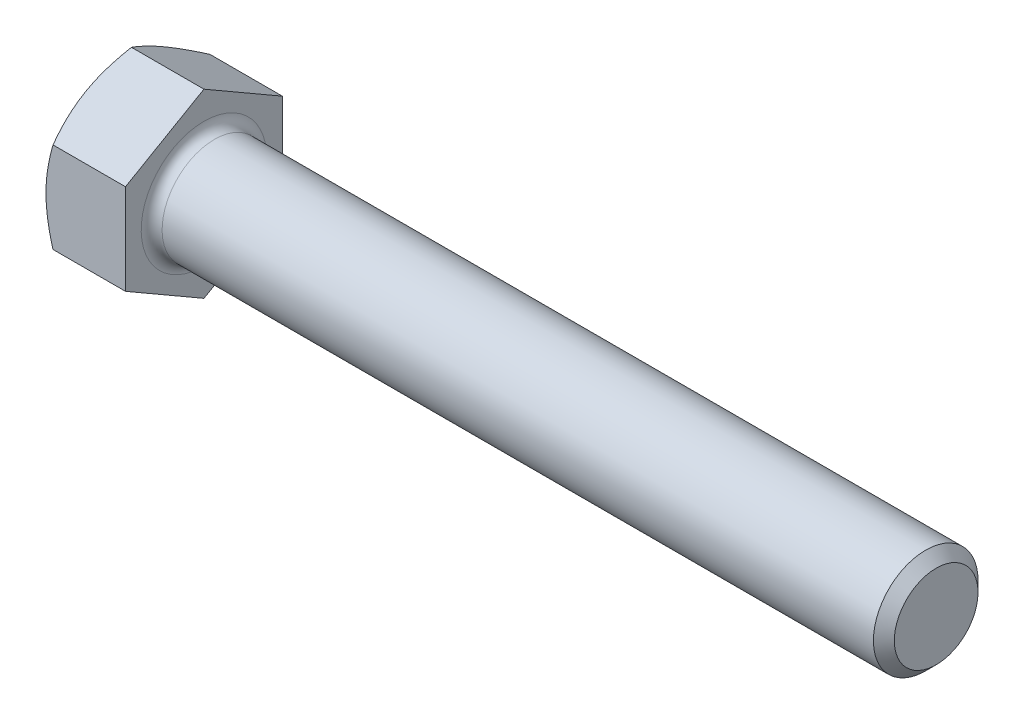
ISO-10303-21;
HEADER;
FILE_DESCRIPTION(('STEP AP214'),'2;1');
FILE_NAME('part.step','',(''),(''),'','','');
FILE_SCHEMA(('AUTOMOTIVE_DESIGN { 1 0 10303 214 1 1 1 1 }'));
ENDSEC;
DATA;
#1=APPLICATION_CONTEXT('core data for automotive mechanical design processes');
#2=APPLICATION_PROTOCOL_DEFINITION('international standard','automotive_design',2000,#1);
#3=PRODUCT_CONTEXT('',#1,'mechanical');
#4=PRODUCT('Part','Part','',(#3));
#5=PRODUCT_RELATED_PRODUCT_CATEGORY('part','',(#4));
#6=PRODUCT_DEFINITION_FORMATION('','',#4);
#7=PRODUCT_DEFINITION_CONTEXT('part definition',#1,'design');
#8=PRODUCT_DEFINITION('design','',#6,#7);
#9=PRODUCT_DEFINITION_SHAPE('','',#8);
#10=(LENGTH_UNIT() NAMED_UNIT(*) SI_UNIT(.MILLI.,.METRE.));
#11=(NAMED_UNIT(*) PLANE_ANGLE_UNIT() SI_UNIT($,.RADIAN.));
#12=(NAMED_UNIT(*) SI_UNIT($,.STERADIAN.) SOLID_ANGLE_UNIT());
#13=UNCERTAINTY_MEASURE_WITH_UNIT(LENGTH_MEASURE(1.E-05),#10,'distance_accuracy_value','');
#14=(GEOMETRIC_REPRESENTATION_CONTEXT(3) GLOBAL_UNCERTAINTY_ASSIGNED_CONTEXT((#13)) GLOBAL_UNIT_ASSIGNED_CONTEXT((#10,
#11,#12)) REPRESENTATION_CONTEXT('',''));
#15=CARTESIAN_POINT('',(0.,0.,0.));
#16=DIRECTION('',(0.,0.,1.));
#17=DIRECTION('',(1.,0.,0.));
#18=AXIS2_PLACEMENT_3D('',#15,#16,#17);
#19=CARTESIAN_POINT('',(-4.826,2.74963065701559,-4.7625));
#20=DIRECTION('',(0.,-0.866025403784439,0.499999999999999));
#21=DIRECTION('',(0.,-0.5,-0.866025403784439));
#22=AXIS2_PLACEMENT_3D('',#19,#20,#21);
#23=PLANE('',#22);
#24=CARTESIAN_POINT('',(-4.40056398824924,5.49937678408502,0.000200000000005412));
#25=CARTESIAN_POINT('',(-4.47034638758606,5.37853889601657,-0.209097361613873));
#26=CARTESIAN_POINT('',(-4.53381673538478,5.25666747870888,-0.420184848381223));
#27=CARTESIAN_POINT('',(-4.64460480393128,5.01081433128269,-0.846014990924108));
#28=CARTESIAN_POINT('',(-4.69188333457021,4.88682823299882,-1.060765212584));
#29=CARTESIAN_POINT('',(-4.76546647463122,4.64037371706653,-1.48763695593352));
#30=CARTESIAN_POINT('',(-4.79226120779827,4.5179436811604,-1.69969199849541));
#31=CARTESIAN_POINT('',(-4.81628887781912,4.33386795649884,-2.01852050604929));
#32=CARTESIAN_POINT('',(-4.82160535899069,4.27246738882597,-2.12486940887228));
#33=CARTESIAN_POINT('',(-4.8267598365683,4.1496095068933,-2.33766550248997));
#34=CARTESIAN_POINT('',(-4.82659800219079,4.08815219444488,-2.44411269014726));
#35=CARTESIAN_POINT('',(-4.81861505017809,3.9197756106675,-2.73574948805455));
#36=CARTESIAN_POINT('',(-4.80520757951211,3.81291212955969,-2.92084246680696));
#37=CARTESIAN_POINT('',(-4.76269213715631,3.59989441060936,-3.28979997894136));
#38=CARTESIAN_POINT('',(-4.7335696317199,3.49374092153974,-3.47366321541066));
#39=CARTESIAN_POINT('',(-4.6607707464131,3.28029401006835,-3.84336411079776));
#40=CARTESIAN_POINT('',(-4.61678588695335,3.17302752682367,-4.02915510972678));
#41=CARTESIAN_POINT('',(-4.51695772006118,2.96009430473234,-4.39796626900832));
#42=CARTESIAN_POINT('',(-4.46113786532195,2.85442483842812,-4.5809911534559));
#43=CARTESIAN_POINT('',(-4.40056398824924,2.74951518696175,-4.7627));
#44=B_SPLINE_CURVE_WITH_KNOTS('',3,(#24,#25,#26,#27,#28,#29,#30,#31,#32,#33,#34,#35,#36,#37,#38,
#39,#40,#41,#42,#43),.UNSPECIFIED.,.F.,.F.,(4,2,2,2,2,2,2,2,2,4),(0.,0.754910190012916,
1.51163483480638,2.24963134670894,2.61827336240839,2.9869039913527,3.62867423192249,
4.27103902109236,4.92765153591996,5.58297484368455),.UNSPECIFIED.);
#45=CARTESIAN_POINT('',(-4.4006306570156,5.49926131403118,0.));
#46=VERTEX_POINT('',#45);
#47=CARTESIAN_POINT('',(-4.826,4.12444598552339,-2.38124999999999));
#48=VERTEX_POINT('',#47);
#49=EDGE_CURVE('E112',#46,#48,#44,.T.);
#50=ORIENTED_EDGE('',*,*,#49,.F.);
#51=DIRECTION('',(1.,0.,0.));
#52=VECTOR('',#51,1.);
#53=CARTESIAN_POINT('',(-4.826,5.49926131403118,0.));
#54=LINE('',#53,#52);
#55=CARTESIAN_POINT('',(0.,5.49926131403118,0.));
#56=VERTEX_POINT('',#55);
#57=EDGE_CURVE('E125',#46,#56,#54,.T.);
#58=ORIENTED_EDGE('',*,*,#57,.T.);
#59=DIRECTION('',(0.,-0.5,-0.866025403784439));
#60=VECTOR('',#59,1.);
#61=CARTESIAN_POINT('',(0.,2.74963065701559,-4.7625));
#62=LINE('',#61,#60);
#63=CARTESIAN_POINT('',(0.,2.74963065701559,-4.7625));
#64=VERTEX_POINT('',#63);
#65=EDGE_CURVE('E129',#56,#64,#62,.T.);
#66=ORIENTED_EDGE('',*,*,#65,.T.);
#67=DIRECTION('',(1.,0.,0.));
#68=VECTOR('',#67,1.);
#69=CARTESIAN_POINT('',(-4.826,2.74963065701559,-4.7625));
#70=LINE('',#69,#68);
#71=CARTESIAN_POINT('',(-4.4006306570156,2.74963065701559,-4.7625));
#72=VERTEX_POINT('',#71);
#73=EDGE_CURVE('E148',#72,#64,#70,.T.);
#74=ORIENTED_EDGE('',*,*,#73,.F.);
#75=EDGE_CURVE('E128',#48,#72,#44,.T.);
#76=ORIENTED_EDGE('',*,*,#75,.F.);
#77=EDGE_LOOP('',(#50,#58,#66,#74,#76));
#78=FACE_BOUND('',#77,.T.);
#79=ADVANCED_FACE('F36',(#78),#23,.F.);
#80=CARTESIAN_POINT('',(-4.826,-2.74963065701559,-4.7625));
#81=DIRECTION('',(0.,0.,1.));
#82=DIRECTION('',(0.,-1.,0.));
#83=AXIS2_PLACEMENT_3D('',#80,#81,#82);
#84=PLANE('',#83);
#85=CARTESIAN_POINT('',(-2.53865492995422,-7.30971731156661,-4.7625));
#86=CARTESIAN_POINT('',(-2.63894582516318,-7.10233411794664,-4.7625));
#87=CARTESIAN_POINT('',(-2.73825279152594,-6.89446659321094,-4.7625));
#88=CARTESIAN_POINT('',(-2.93434388978706,-6.47750501700678,-4.7625));
#89=CARTESIAN_POINT('',(-3.03112760832201,-6.26841077136273,-4.7625));
#90=CARTESIAN_POINT('',(-3.22212058726197,-5.84762353880586,-4.7625));
#91=CARTESIAN_POINT('',(-3.31631227627624,-5.63592254799053,-4.7625));
#92=CARTESIAN_POINT('',(-3.50073783411751,-5.2108098706162,-4.7625));
#93=CARTESIAN_POINT('',(-3.59097189530315,-4.99739826779835,-4.7625));
#94=CARTESIAN_POINT('',(-3.76913037535412,-4.56193618326943,-4.7625));
#95=CARTESIAN_POINT('',(-3.85689893159286,-4.33982157619656,-4.7625));
#96=CARTESIAN_POINT('',(-4.02560705643309,-3.89296573863796,-4.7625));
#97=CARTESIAN_POINT('',(-4.10654584809015,-3.6682242126196,-4.7625));
#98=CARTESIAN_POINT('',(-4.25941364359694,-3.21620296888463,-4.7625));
#99=CARTESIAN_POINT('',(-4.33136156692013,-2.98892971583964,-4.7625));
#100=CARTESIAN_POINT('',(-4.46388883392356,-2.53112455985058,-4.7625));
#101=CARTESIAN_POINT('',(-4.52447184026846,-2.30059373259607,-4.7625));
#102=CARTESIAN_POINT('',(-4.6309943175041,-1.83740766983983,-4.7625));
#103=CARTESIAN_POINT('',(-4.67701029190918,-1.60477036374114,-4.7625));
#104=CARTESIAN_POINT('',(-4.75174576579707,-1.13668440796651,-4.7625));
#105=CARTESIAN_POINT('',(-4.78046675134188,-0.901236001606197,-4.7625));
#106=CARTESIAN_POINT('',(-4.81794377379008,-0.431746037216489,-4.7625));
#107=CARTESIAN_POINT('',(-4.82695039796689,-0.197724985343648,-4.7625));
#108=CARTESIAN_POINT('',(-4.82489021390358,0.270245165970698,-4.7625));
#109=CARTESIAN_POINT('',(-4.81382285651618,0.504194263268692,-4.7625));
#110=CARTESIAN_POINT('',(-4.77855727161905,0.903673507099814,-4.7625));
#111=CARTESIAN_POINT('',(-4.75901888428981,1.06963824347709,-4.7625));
#112=CARTESIAN_POINT('',(-4.71109832669434,1.4002949446895,-4.7625));
#113=CARTESIAN_POINT('',(-4.68271488786702,1.56498672348217,-4.7625));
#114=CARTESIAN_POINT('',(-4.58579509515289,2.05696621832222,-4.7625));
#115=CARTESIAN_POINT('',(-4.50550882608358,2.38196188542261,-4.7625));
#116=CARTESIAN_POINT('',(-4.36703014941268,2.86781398854699,-4.7625));
#117=CARTESIAN_POINT('',(-4.31723714803653,3.03120713132935,-4.7625));
#118=CARTESIAN_POINT('',(-4.21266440559822,3.35640511661037,-4.7625));
#119=CARTESIAN_POINT('',(-4.15788463273706,3.51820994897361,-4.7625));
#120=CARTESIAN_POINT('',(-4.04420190764095,3.84028616885704,-4.7625));
#121=CARTESIAN_POINT('',(-3.9853004369361,4.00055808407178,-4.7625));
#122=CARTESIAN_POINT('',(-3.86404874825557,4.31978669318692,-4.7625));
#123=CARTESIAN_POINT('',(-3.80169856215817,4.47874339922889,-4.7625));
#124=CARTESIAN_POINT('',(-3.65635700460677,4.8396055882017,-4.7625));
#125=CARTESIAN_POINT('',(-3.57245322794143,5.04114279911414,-4.7625));
#126=CARTESIAN_POINT('',(-3.40089342493739,5.44261795808367,-4.7625));
#127=CARTESIAN_POINT('',(-3.31323721756385,5.64255582842752,-4.76249999999999));
#128=CARTESIAN_POINT('',(-3.13488930867042,6.04110971320488,-4.76249999999999));
#129=CARTESIAN_POINT('',(-3.04419710529245,6.23972550252466,-4.76249999999999));
#130=CARTESIAN_POINT('',(-2.86034980666286,6.63581552297746,-4.76249999999999));
#131=CARTESIAN_POINT('',(-2.76719466563982,6.83328973281206,-4.76249999999999));
#132=CARTESIAN_POINT('',(-2.48455741628422,7.42461069797956,-4.76249999999999));
#133=CARTESIAN_POINT('',(-2.29205806653975,7.817014673705,-4.76249999999999));
#134=CARTESIAN_POINT('',(-1.90151383619552,8.5990520506164,-4.76249999999999));
#135=CARTESIAN_POINT('',(-1.70346877205877,8.98868535956997,-4.76249999999999));
#136=CARTESIAN_POINT('',(-1.31897377005232,9.7356118369776,-4.76249999999999));
#137=CARTESIAN_POINT('',(-1.13282282853607,10.093059202551,-4.76249999999999));
#138=CARTESIAN_POINT('',(-0.75794689692703,10.8066127209674,-4.76249999999999));
#139=CARTESIAN_POINT('',(-0.569221831900088,11.1627188343791,-4.76249999999999));
#140=CARTESIAN_POINT('',(-0.190210631481143,11.8730921528281,-4.76249999999999));
#141=CARTESIAN_POINT('',(7.11576984302486E-05,12.2273616797313,-4.76249999999999));
#142=CARTESIAN_POINT('',(0.382198882261842,12.9350341524318,-4.76249999999999));
#143=CARTESIAN_POINT('',(0.574044740694436,13.2884371397628,-4.76249999999999));
#144=CARTESIAN_POINT('',(0.766479229564005,13.6415169914972,-4.76249999999999));
#145=B_SPLINE_CURVE_WITH_KNOTS('',3,(#85,#86,#87,#88,#89,#90,#91,#92,#93,#94,#95,#96,#97,#98,
#99,#100,#101,#102,#103,#104,#105,#106,#107,#108,#109,#110,#111,#112,#113,#114,#115,#116,#117,
#118,#119,#120,#121,#122,#123,#124,#125,#126,#127,#128,#129,#130,#131,#132,#133,#134,#135,#136,
#137,#138,#139,#140,#141,#142,#143,#144),.UNSPECIFIED.,.F.,.F.,(4,2,2,2,2,2,2,2,2,2,2,2,2,2,2,2,
2,2,2,2,2,2,2,2,2,2,2,2,2,4),(0.,0.691090929530282,1.38229437243686,2.07739107275608,
2.77245395070163,3.48884745798766,4.20532235163324,4.92026322857102,5.63497329833932,
6.3458650497355,7.05669570944579,7.75843728919175,8.46019806619033,8.96128606484996,
9.46244596286593,10.4653546355007,10.9777490611263,11.4901467543507,12.0023612047988,
12.514570921371,13.1694362862203,13.8243332805291,14.4793390708444,15.1343570424044,
16.4455162651803,17.7567189325479,18.9657490980689,20.1748145345615,21.3812208217427,
22.5875681084214),.UNSPECIFIED.);
#146=CARTESIAN_POINT('',(-4.826,0.,-4.7625));
#147=VERTEX_POINT('',#146);
#148=EDGE_CURVE('E194',#72,#147,#145,.F.);
#149=ORIENTED_EDGE('',*,*,#148,.F.);
#150=ORIENTED_EDGE('',*,*,#73,.T.);
#151=DIRECTION('',(0.,-1.,0.));
#152=VECTOR('',#151,1.);
#153=CARTESIAN_POINT('',(0.,-2.74963065701559,-4.7625));
#154=LINE('',#153,#152);
#155=CARTESIAN_POINT('',(0.,-2.74963065701559,-4.7625));
#156=VERTEX_POINT('',#155);
#157=EDGE_CURVE('E404',#64,#156,#154,.T.);
#158=ORIENTED_EDGE('',*,*,#157,.T.);
#159=DIRECTION('',(1.,0.,0.));
#160=VECTOR('',#159,1.);
#161=CARTESIAN_POINT('',(-4.826,-2.74963065701559,-4.7625));
#162=LINE('',#161,#160);
#163=CARTESIAN_POINT('',(-4.4006306570156,-2.74963065701559,-4.7625));
#164=VERTEX_POINT('',#163);
#165=EDGE_CURVE('E146',#164,#156,#162,.T.);
#166=ORIENTED_EDGE('',*,*,#165,.F.);
#167=EDGE_CURVE('E195',#147,#164,#145,.F.);
#168=ORIENTED_EDGE('',*,*,#167,.F.);
#169=EDGE_LOOP('',(#149,#150,#158,#166,#168));
#170=FACE_BOUND('',#169,.T.);
#171=ADVANCED_FACE('F174',(#170),#84,.F.);
#172=CARTESIAN_POINT('',(-4.826,-5.49926131403118,0.));
#173=DIRECTION('',(0.,0.866025403784438,0.5));
#174=DIRECTION('',(0.,-0.5,0.866025403784438));
#175=AXIS2_PLACEMENT_3D('',#172,#173,#174);
#176=PLANE('',#175);
#177=CARTESIAN_POINT('',(-4.40056398824924,-2.74951518696175,-4.7627));
#178=CARTESIAN_POINT('',(-4.47034638758606,-2.8703530750302,-4.55340263838612));
#179=CARTESIAN_POINT('',(-4.53381673538478,-2.99222449233789,-4.34231515161877));
#180=CARTESIAN_POINT('',(-4.64460480393128,-3.23807763976409,-3.91648500907589));
#181=CARTESIAN_POINT('',(-4.69188333457021,-3.36206373804796,-3.701734787416));
#182=CARTESIAN_POINT('',(-4.76546647463122,-3.60851825398025,-3.27486304406647));
#183=CARTESIAN_POINT('',(-4.79226120779828,-3.73094828988637,-3.06280800150458));
#184=CARTESIAN_POINT('',(-4.81628887781913,-3.91502401454793,-2.7439794939507));
#185=CARTESIAN_POINT('',(-4.82160535899069,-3.9764245822208,-2.63763059112772));
#186=CARTESIAN_POINT('',(-4.8267598365683,-4.09928246415348,-2.42483449751002));
#187=CARTESIAN_POINT('',(-4.8265980021908,-4.16073977660189,-2.31838730985274));
#188=CARTESIAN_POINT('',(-4.81861505017809,-4.32911636037927,-2.02675051194544));
#189=CARTESIAN_POINT('',(-4.80520757951211,-4.43597984148708,-1.84165753319303));
#190=CARTESIAN_POINT('',(-4.76269213715631,-4.64899756043742,-1.47270002105863));
#191=CARTESIAN_POINT('',(-4.7335696317199,-4.75515104950704,-1.28883678458933));
#192=CARTESIAN_POINT('',(-4.6607707464131,-4.96859796097843,-0.919135889202235));
#193=CARTESIAN_POINT('',(-4.61678588695335,-5.07586444422311,-0.733344890273215));
#194=CARTESIAN_POINT('',(-4.51695772006118,-5.28879766631444,-0.364533730991681));
#195=CARTESIAN_POINT('',(-4.46113786532195,-5.39446713261865,-0.181508846544095));
#196=CARTESIAN_POINT('',(-4.40056398824924,-5.49937678408502,0.000199999999996873));
#197=B_SPLINE_CURVE_WITH_KNOTS('',3,(#177,#178,#179,#180,#181,#182,#183,#184,#185,#186,#187,
#188,#189,#190,#191,#192,#193,#194,#195,#196),.UNSPECIFIED.,.F.,.F.,(4,2,2,2,2,2,2,2,2,4),(0.,
0.754910190012916,1.51163483480638,2.24963134670895,2.61827336240839,2.9869039913527,
3.62867423192249,4.27103902109236,4.92765153591996,5.58297484368455),.UNSPECIFIED.);
#198=CARTESIAN_POINT('',(-4.826,-4.12444598552338,-2.38125));
#199=VERTEX_POINT('',#198);
#200=EDGE_CURVE('E233',#164,#199,#197,.T.);
#201=ORIENTED_EDGE('',*,*,#200,.F.);
#202=ORIENTED_EDGE('',*,*,#165,.T.);
#203=DIRECTION('',(0.,-0.5,0.866025403784438));
#204=VECTOR('',#203,1.);
#205=CARTESIAN_POINT('',(0.,-5.49926131403118,0.));
#206=LINE('',#205,#204);
#207=CARTESIAN_POINT('',(0.,-5.49926131403118,0.));
#208=VERTEX_POINT('',#207);
#209=EDGE_CURVE('E405',#156,#208,#206,.T.);
#210=ORIENTED_EDGE('',*,*,#209,.T.);
#211=DIRECTION('',(1.,0.,0.));
#212=VECTOR('',#211,1.);
#213=CARTESIAN_POINT('',(-4.826,-5.49926131403118,0.));
#214=LINE('',#213,#212);
#215=CARTESIAN_POINT('',(-4.4006306570156,-5.49926131403118,0.));
#216=VERTEX_POINT('',#215);
#217=EDGE_CURVE('E144',#216,#208,#214,.T.);
#218=ORIENTED_EDGE('',*,*,#217,.F.);
#219=EDGE_CURVE('E229',#199,#216,#197,.T.);
#220=ORIENTED_EDGE('',*,*,#219,.F.);
#221=EDGE_LOOP('',(#201,#202,#210,#218,#220));
#222=FACE_BOUND('',#221,.T.);
#223=ADVANCED_FACE('F179',(#222),#176,.F.);
#224=CARTESIAN_POINT('',(-4.826,-2.7496306570156,4.7625));
#225=DIRECTION('',(0.,0.866025403784439,-0.499999999999999));
#226=DIRECTION('',(0.,0.499999999999999,0.866025403784439));
#227=AXIS2_PLACEMENT_3D('',#224,#225,#226);
#228=PLANE('',#227);
#229=CARTESIAN_POINT('',(-4.40056398824924,-5.49937678408502,-0.000200000000003331));
#230=CARTESIAN_POINT('',(-4.47034638758606,-5.37853889601657,0.209097361613875));
#231=CARTESIAN_POINT('',(-4.53381673538478,-5.25666747870888,0.420184848381226));
#232=CARTESIAN_POINT('',(-4.64460480393128,-5.01081433128269,0.846014990924112));
#233=CARTESIAN_POINT('',(-4.69188333457021,-4.88682823299882,1.060765212584));
#234=CARTESIAN_POINT('',(-4.76546647463122,-4.64037371706653,1.48763695593353));
#235=CARTESIAN_POINT('',(-4.79226120779828,-4.5179436811604,1.69969199849541));
#236=CARTESIAN_POINT('',(-4.81628887781913,-4.33386795649884,2.0185205060493));
#237=CARTESIAN_POINT('',(-4.82160535899069,-4.27246738882597,2.12486940887228));
#238=CARTESIAN_POINT('',(-4.8267598365683,-4.1496095068933,2.33766550248998));
#239=CARTESIAN_POINT('',(-4.8265980021908,-4.08815219444488,2.44411269014726));
#240=CARTESIAN_POINT('',(-4.81861505017809,-3.9197756106675,2.73574948805456));
#241=CARTESIAN_POINT('',(-4.80520757951211,-3.81291212955969,2.92084246680697));
#242=CARTESIAN_POINT('',(-4.76269213715631,-3.59989441060936,3.28979997894137));
#243=CARTESIAN_POINT('',(-4.7335696317199,-3.49374092153974,3.47366321541067));
#244=CARTESIAN_POINT('',(-4.6607707464131,-3.28029401006835,3.84336411079776));
#245=CARTESIAN_POINT('',(-4.61678588695335,-3.17302752682367,4.02915510972678));
#246=CARTESIAN_POINT('',(-4.51695772006118,-2.96009430473234,4.39796626900832));
#247=CARTESIAN_POINT('',(-4.46113786532195,-2.85442483842813,4.5809911534559));
#248=CARTESIAN_POINT('',(-4.40056398824924,-2.74951518696176,4.7627));
#249=B_SPLINE_CURVE_WITH_KNOTS('',3,(#229,#230,#231,#232,#233,#234,#235,#236,#237,#238,#239,
#240,#241,#242,#243,#244,#245,#246,#247,#248),.UNSPECIFIED.,.F.,.F.,(4,2,2,2,2,2,2,2,2,4),(0.,
0.754910190012917,1.51163483480638,2.24963134670895,2.61827336240839,2.9869039913527,
3.62867423192249,4.27103902109236,4.92765153591996,5.58297484368455),.UNSPECIFIED.);
#250=CARTESIAN_POINT('',(-4.826,-4.12444598552339,2.38125));
#251=VERTEX_POINT('',#250);
#252=EDGE_CURVE('E59',#216,#251,#249,.T.);
#253=ORIENTED_EDGE('',*,*,#252,.F.);
#254=ORIENTED_EDGE('',*,*,#217,.T.);
#255=DIRECTION('',(0.,0.499999999999999,0.866025403784439));
#256=VECTOR('',#255,1.);
#257=CARTESIAN_POINT('',(0.,-2.7496306570156,4.7625));
#258=LINE('',#257,#256);
#259=CARTESIAN_POINT('',(0.,-2.7496306570156,4.7625));
#260=VERTEX_POINT('',#259);
#261=EDGE_CURVE('E401',#208,#260,#258,.T.);
#262=ORIENTED_EDGE('',*,*,#261,.T.);
#263=DIRECTION('',(1.,0.,0.));
#264=VECTOR('',#263,1.);
#265=CARTESIAN_POINT('',(-4.826,-2.7496306570156,4.7625));
#266=LINE('',#265,#264);
#267=CARTESIAN_POINT('',(-4.4006306570156,-2.7496306570156,4.7625));
#268=VERTEX_POINT('',#267);
#269=EDGE_CURVE('E137',#268,#260,#266,.T.);
#270=ORIENTED_EDGE('',*,*,#269,.F.);
#271=EDGE_CURVE('E224',#251,#268,#249,.T.);
#272=ORIENTED_EDGE('',*,*,#271,.F.);
#273=EDGE_LOOP('',(#253,#254,#262,#270,#272));
#274=FACE_BOUND('',#273,.T.);
#275=ADVANCED_FACE('F236',(#274),#228,.F.);
#276=CARTESIAN_POINT('',(-4.826,2.74963065701559,4.7625));
#277=DIRECTION('',(0.,0.,-1.));
#278=DIRECTION('',(0.,1.,0.));
#279=AXIS2_PLACEMENT_3D('',#276,#277,#278);
#280=PLANE('',#279);
#281=CARTESIAN_POINT('',(-2.53865492995422,-7.30971731156661,4.76249999999999));
#282=CARTESIAN_POINT('',(-2.63894582516318,-7.10233411794665,4.76249999999999));
#283=CARTESIAN_POINT('',(-2.73825279152594,-6.89446659321094,4.76249999999999));
#284=CARTESIAN_POINT('',(-2.93434388978706,-6.47750501700678,4.76249999999999));
#285=CARTESIAN_POINT('',(-3.03112760832201,-6.26841077136274,4.76249999999999));
#286=CARTESIAN_POINT('',(-3.22212058726197,-5.84762353880587,4.76249999999999));
#287=CARTESIAN_POINT('',(-3.31631227627624,-5.63592254799054,4.76249999999999));
#288=CARTESIAN_POINT('',(-3.50073783411751,-5.21080987061621,4.76249999999999));
#289=CARTESIAN_POINT('',(-3.59097189530315,-4.99739826779836,4.76249999999999));
#290=CARTESIAN_POINT('',(-3.76913037535412,-4.56193618326944,4.76249999999999));
#291=CARTESIAN_POINT('',(-3.85689893159286,-4.33982157619657,4.76249999999999));
#292=CARTESIAN_POINT('',(-4.02560705643309,-3.89296573863797,4.76249999999999));
#293=CARTESIAN_POINT('',(-4.10654584809015,-3.6682242126196,4.76249999999999));
#294=CARTESIAN_POINT('',(-4.25941364359694,-3.21620296888463,4.76249999999999));
#295=CARTESIAN_POINT('',(-4.33136156692013,-2.98892971583965,4.7625));
#296=CARTESIAN_POINT('',(-4.46388883392356,-2.53112455985059,4.7625));
#297=CARTESIAN_POINT('',(-4.52447184026846,-2.30059373259607,4.7625));
#298=CARTESIAN_POINT('',(-4.6309943175041,-1.83740766983984,4.7625));
#299=CARTESIAN_POINT('',(-4.67701029190918,-1.60477036374115,4.7625));
#300=CARTESIAN_POINT('',(-4.75174576579707,-1.13668440796652,4.7625));
#301=CARTESIAN_POINT('',(-4.78046675134188,-0.901236001606206,4.7625));
#302=CARTESIAN_POINT('',(-4.81794377379008,-0.431746037216497,4.7625));
#303=CARTESIAN_POINT('',(-4.82695039796689,-0.197724985343655,4.7625));
#304=CARTESIAN_POINT('',(-4.82489021390358,0.270245165970691,4.7625));
#305=CARTESIAN_POINT('',(-4.81382285651618,0.504194263268686,4.7625));
#306=CARTESIAN_POINT('',(-4.77855727161905,0.903673507099808,4.7625));
#307=CARTESIAN_POINT('',(-4.75901888428981,1.06963824347708,4.7625));
#308=CARTESIAN_POINT('',(-4.71109832669434,1.40029494468949,4.7625));
#309=CARTESIAN_POINT('',(-4.68271488786702,1.56498672348216,4.7625));
#310=CARTESIAN_POINT('',(-4.58579509515289,2.05696621832221,4.7625));
#311=CARTESIAN_POINT('',(-4.50550882608357,2.3819618854226,4.7625));
#312=CARTESIAN_POINT('',(-4.36703014941267,2.86781398854699,4.7625));
#313=CARTESIAN_POINT('',(-4.31723714803653,3.03120713132935,4.7625));
#314=CARTESIAN_POINT('',(-4.21266440559822,3.35640511661037,4.7625));
#315=CARTESIAN_POINT('',(-4.15788463273706,3.5182099489736,4.7625));
#316=CARTESIAN_POINT('',(-4.04420190764094,3.84028616885704,4.7625));
#317=CARTESIAN_POINT('',(-3.98530043693609,4.00055808407178,4.7625));
#318=CARTESIAN_POINT('',(-3.86404874825556,4.31978669318692,4.7625));
#319=CARTESIAN_POINT('',(-3.80169856215817,4.47874339922889,4.7625));
#320=CARTESIAN_POINT('',(-3.65635700460677,4.8396055882017,4.7625));
#321=CARTESIAN_POINT('',(-3.57245322794143,5.04114279911414,4.7625));
#322=CARTESIAN_POINT('',(-3.40089342493739,5.44261795808366,4.7625));
#323=CARTESIAN_POINT('',(-3.31323721756385,5.64255582842751,4.7625));
#324=CARTESIAN_POINT('',(-3.13488930867042,6.04110971320488,4.7625));
#325=CARTESIAN_POINT('',(-3.04419710529245,6.23972550252465,4.7625));
#326=CARTESIAN_POINT('',(-2.86034980666286,6.63581552297746,4.7625));
#327=CARTESIAN_POINT('',(-2.76719466563982,6.83328973281205,4.76250000000001));
#328=CARTESIAN_POINT('',(-2.48455741628422,7.42461069797955,4.76250000000001));
#329=CARTESIAN_POINT('',(-2.29205806653975,7.81701467370499,4.76250000000001));
#330=CARTESIAN_POINT('',(-1.90151383619552,8.5990520506164,4.76250000000001));
#331=CARTESIAN_POINT('',(-1.70346877205876,8.98868535956997,4.76250000000001));
#332=CARTESIAN_POINT('',(-1.31897377005232,9.7356118369776,4.76250000000001));
#333=CARTESIAN_POINT('',(-1.13282282853607,10.093059202551,4.76250000000001));
#334=CARTESIAN_POINT('',(-0.757946896927029,10.8066127209674,4.76250000000001));
#335=CARTESIAN_POINT('',(-0.569221831900086,11.162718834379,4.76250000000001));
#336=CARTESIAN_POINT('',(-0.190210631481141,11.8730921528281,4.76250000000001));
#337=CARTESIAN_POINT('',(7.11576984315497E-05,12.2273616797313,4.76250000000001));
#338=CARTESIAN_POINT('',(0.382198882261843,12.9350341524318,4.76250000000001));
#339=CARTESIAN_POINT('',(0.574044740694438,13.2884371397628,4.76250000000001));
#340=CARTESIAN_POINT('',(0.766479229564007,13.6415169914972,4.76250000000001));
#341=B_SPLINE_CURVE_WITH_KNOTS('',3,(#281,#282,#283,#284,#285,#286,#287,#288,#289,#290,#291,
#292,#293,#294,#295,#296,#297,#298,#299,#300,#301,#302,#303,#304,#305,#306,#307,#308,#309,#310,
#311,#312,#313,#314,#315,#316,#317,#318,#319,#320,#321,#322,#323,#324,#325,#326,#327,#328,#329,
#330,#331,#332,#333,#334,#335,#336,#337,#338,#339,#340),.UNSPECIFIED.,.F.,.F.,(4,2,2,2,2,2,2,2,
2,2,2,2,2,2,2,2,2,2,2,2,2,2,2,2,2,2,2,2,2,4),(0.,0.691090929530282,1.38229437243686,
2.07739107275608,2.77245395070163,3.48884745798766,4.20532235163324,4.92026322857102,
5.63497329833932,6.3458650497355,7.05669570944579,7.75843728919175,8.46019806619033,
8.96128606484995,9.46244596286593,10.4653546355007,10.9777490611263,11.4901467543506,
12.0023612047988,12.514570921371,13.1694362862203,13.8243332805291,14.4793390708444,
15.1343570424044,16.4455162651803,17.7567189325479,18.9657490980689,20.1748145345615,
21.3812208217427,22.5875681084214),.UNSPECIFIED.);
#342=CARTESIAN_POINT('',(-4.826,0.,4.7625));
#343=VERTEX_POINT('',#342);
#344=EDGE_CURVE('E51',#268,#343,#341,.T.);
#345=ORIENTED_EDGE('',*,*,#344,.F.);
#346=ORIENTED_EDGE('',*,*,#269,.T.);
#347=DIRECTION('',(0.,1.,0.));
#348=VECTOR('',#347,1.);
#349=CARTESIAN_POINT('',(0.,2.74963065701559,4.7625));
#350=LINE('',#349,#348);
#351=CARTESIAN_POINT('',(0.,2.74963065701559,4.7625));
#352=VERTEX_POINT('',#351);
#353=EDGE_CURVE('E139',#260,#352,#350,.T.);
#354=ORIENTED_EDGE('',*,*,#353,.T.);
#355=DIRECTION('',(1.,0.,0.));
#356=VECTOR('',#355,1.);
#357=CARTESIAN_POINT('',(-4.826,2.74963065701559,4.7625));
#358=LINE('',#357,#356);
#359=CARTESIAN_POINT('',(-4.4006306570156,2.74963065701559,4.7625));
#360=VERTEX_POINT('',#359);
#361=EDGE_CURVE('E135',#360,#352,#358,.T.);
#362=ORIENTED_EDGE('',*,*,#361,.F.);
#363=EDGE_CURVE('E217',#343,#360,#341,.T.);
#364=ORIENTED_EDGE('',*,*,#363,.F.);
#365=EDGE_LOOP('',(#345,#346,#354,#362,#364));
#366=FACE_BOUND('',#365,.T.);
#367=ADVANCED_FACE('F240',(#366),#280,.F.);
#368=CARTESIAN_POINT('',(-4.826,5.49926131403118,0.));
#369=DIRECTION('',(0.,-0.866025403784438,-0.500000000000001));
#370=DIRECTION('',(0.,0.500000000000001,-0.866025403784438));
#371=AXIS2_PLACEMENT_3D('',#368,#369,#370);
#372=PLANE('',#371);
#373=CARTESIAN_POINT('',(-4.40056398824924,2.74951518696175,4.7627));
#374=CARTESIAN_POINT('',(-4.47034638758606,2.8703530750302,4.55340263838612));
#375=CARTESIAN_POINT('',(-4.53381673538478,2.99222449233789,4.34231515161877));
#376=CARTESIAN_POINT('',(-4.64460480393128,3.23807763976408,3.91648500907589));
#377=CARTESIAN_POINT('',(-4.69188333457021,3.36206373804795,3.701734787416));
#378=CARTESIAN_POINT('',(-4.76546647463122,3.60851825398025,3.27486304406647));
#379=CARTESIAN_POINT('',(-4.79226120779827,3.73094828988637,3.06280800150459));
#380=CARTESIAN_POINT('',(-4.81628887781912,3.91502401454793,2.74397949395071));
#381=CARTESIAN_POINT('',(-4.82160535899069,3.9764245822208,2.63763059112772));
#382=CARTESIAN_POINT('',(-4.82675983656829,4.09928246415348,2.42483449751003));
#383=CARTESIAN_POINT('',(-4.82659800219079,4.16073977660189,2.31838730985274));
#384=CARTESIAN_POINT('',(-4.81861505017809,4.32911636037927,2.02675051194544));
#385=CARTESIAN_POINT('',(-4.80520757951211,4.43597984148708,1.84165753319304));
#386=CARTESIAN_POINT('',(-4.76269213715631,4.64899756043741,1.47270002105863));
#387=CARTESIAN_POINT('',(-4.7335696317199,4.75515104950704,1.28883678458934));
#388=CARTESIAN_POINT('',(-4.6607707464131,4.96859796097843,0.919135889202237));
#389=CARTESIAN_POINT('',(-4.61678588695335,5.07586444422311,0.733344890273217));
#390=CARTESIAN_POINT('',(-4.51695772006118,5.28879766631444,0.364533730991683));
#391=CARTESIAN_POINT('',(-4.46113786532195,5.39446713261865,0.181508846544097));
#392=CARTESIAN_POINT('',(-4.40056398824924,5.49937678408502,-0.000199999999994664));
#393=B_SPLINE_CURVE_WITH_KNOTS('',3,(#373,#374,#375,#376,#377,#378,#379,#380,#381,#382,#383,
#384,#385,#386,#387,#388,#389,#390,#391,#392),.UNSPECIFIED.,.F.,.F.,(4,2,2,2,2,2,2,2,2,4),(0.,
0.754910190012917,1.51163483480638,2.24963134670895,2.61827336240839,2.9869039913527,
3.62867423192249,4.27103902109236,4.92765153591996,5.58297484368455),.UNSPECIFIED.);
#394=CARTESIAN_POINT('',(-4.826,4.12444598552339,2.38125));
#395=VERTEX_POINT('',#394);
#396=EDGE_CURVE('E119',#360,#395,#393,.T.);
#397=ORIENTED_EDGE('',*,*,#396,.F.);
#398=ORIENTED_EDGE('',*,*,#361,.T.);
#399=DIRECTION('',(0.,0.500000000000001,-0.866025403784438));
#400=VECTOR('',#399,1.);
#401=CARTESIAN_POINT('',(0.,5.49926131403118,0.));
#402=LINE('',#401,#400);
#403=EDGE_CURVE('E133',#352,#56,#402,.T.);
#404=ORIENTED_EDGE('',*,*,#403,.T.);
#405=ORIENTED_EDGE('',*,*,#57,.F.);
#406=EDGE_CURVE('E109',#395,#46,#393,.T.);
#407=ORIENTED_EDGE('',*,*,#406,.F.);
#408=EDGE_LOOP('',(#397,#398,#404,#405,#407));
#409=FACE_BOUND('',#408,.T.);
#410=ADVANCED_FACE('F131',(#409),#372,.F.);
#411=CARTESIAN_POINT('',(44.45,0.,0.));
#412=DIRECTION('',(1.,0.,0.));
#413=DIRECTION('',(0.,1.,0.));
#414=AXIS2_PLACEMENT_3D('',#411,#412,#413);
#415=PLANE('',#414);
#416=CARTESIAN_POINT('',(44.45,0.,0.));
#417=DIRECTION('',(1.,0.,0.));
#418=DIRECTION('',(0.,1.,0.));
#419=AXIS2_PLACEMENT_3D('',#416,#417,#418);
#420=CIRCLE('',#419,2.5399);
#421=CARTESIAN_POINT('',(44.45,2.5399,0.));
#422=VERTEX_POINT('',#421);
#423=EDGE_CURVE('E153',#422,#422,#420,.T.);
#424=ORIENTED_EDGE('',*,*,#423,.T.);
#425=EDGE_LOOP('',(#424));
#426=FACE_BOUND('',#425,.T.);
#427=ADVANCED_FACE('F247',(#426),#415,.T.);
#428=CARTESIAN_POINT('',(44.45,0.,0.));
#429=DIRECTION('',(1.,0.,0.));
#430=DIRECTION('',(0.,1.,0.));
#431=AXIS2_PLACEMENT_3D('',#428,#429,#430);
#432=CYLINDRICAL_SURFACE('',#431,3.175);
#433=CARTESIAN_POINT('',(0.634999999999997,0.,0.));
#434=DIRECTION('',(1.,0.,0.));
#435=DIRECTION('',(0.,1.,0.));
#436=AXIS2_PLACEMENT_3D('',#433,#434,#435);
#437=CIRCLE('',#436,3.175);
#438=CARTESIAN_POINT('',(0.634999999999996,3.175,0.));
#439=VERTEX_POINT('',#438);
#440=EDGE_CURVE('E11',#439,#439,#437,.T.);
#441=ORIENTED_EDGE('',*,*,#440,.T.);
#442=EDGE_LOOP('',(#441));
#443=FACE_BOUND('',#442,.T.);
#444=CARTESIAN_POINT('',(43.815,0.,0.));
#445=DIRECTION('',(1.,0.,0.));
#446=DIRECTION('',(0.,1.,0.));
#447=AXIS2_PLACEMENT_3D('',#444,#445,#446);
#448=CIRCLE('',#447,3.175);
#449=CARTESIAN_POINT('',(43.815,3.175,0.));
#450=VERTEX_POINT('',#449);
#451=EDGE_CURVE('E156',#450,#450,#448,.F.);
#452=ORIENTED_EDGE('',*,*,#451,.T.);
#453=EDGE_LOOP('',(#452));
#454=FACE_BOUND('',#453,.T.);
#455=ADVANCED_FACE('F186',(#443,#454),#432,.T.);
#456=CARTESIAN_POINT('',(0.,0.,0.));
#457=DIRECTION('',(1.,0.,0.));
#458=DIRECTION('',(0.,1.,0.));
#459=AXIS2_PLACEMENT_3D('',#456,#457,#458);
#460=PLANE('',#459);
#461=CARTESIAN_POINT('',(0.,0.,0.));
#462=DIRECTION('',(1.,0.,0.));
#463=DIRECTION('',(0.,1.,0.));
#464=AXIS2_PLACEMENT_3D('',#461,#462,#463);
#465=CIRCLE('',#464,3.81);
#466=CARTESIAN_POINT('',(0.,3.81,0.));
#467=VERTEX_POINT('',#466);
#468=EDGE_CURVE('E44',#467,#467,#465,.F.);
#469=ORIENTED_EDGE('',*,*,#468,.T.);
#470=EDGE_LOOP('',(#469));
#471=FACE_BOUND('',#470,.T.);
#472=ORIENTED_EDGE('',*,*,#65,.F.);
#473=ORIENTED_EDGE('',*,*,#403,.F.);
#474=ORIENTED_EDGE('',*,*,#353,.F.);
#475=ORIENTED_EDGE('',*,*,#261,.F.);
#476=ORIENTED_EDGE('',*,*,#209,.F.);
#477=ORIENTED_EDGE('',*,*,#157,.F.);
#478=EDGE_LOOP('',(#472,#473,#474,#475,#476,#477));
#479=FACE_BOUND('',#478,.T.);
#480=ADVANCED_FACE('F161',(#471,#479),#460,.T.);
#481=CARTESIAN_POINT('',(-4.826,0.,0.));
#482=DIRECTION('',(1.,0.,0.));
#483=DIRECTION('',(0.,1.,0.));
#484=AXIS2_PLACEMENT_3D('',#481,#482,#483);
#485=CONICAL_SURFACE('',#484,4.7625,1.0471975511966);
#486=ORIENTED_EDGE('',*,*,#49,.T.);
#487=CARTESIAN_POINT('',(-4.826,0.,0.));
#488=DIRECTION('',(1.,0.,0.));
#489=DIRECTION('',(0.,1.,0.));
#490=AXIS2_PLACEMENT_3D('',#487,#488,#489);
#491=CIRCLE('',#490,4.7625);
#492=EDGE_CURVE('E114',#48,#395,#491,.T.);
#493=ORIENTED_EDGE('',*,*,#492,.T.);
#494=ORIENTED_EDGE('',*,*,#406,.T.);
#495=EDGE_LOOP('',(#486,#493,#494));
#496=FACE_BOUND('',#495,.T.);
#497=ADVANCED_FACE('F111',(#496),#485,.T.);
#498=ORIENTED_EDGE('',*,*,#75,.T.);
#499=ORIENTED_EDGE('',*,*,#148,.T.);
#500=EDGE_CURVE('E151',#147,#48,#491,.T.);
#501=ORIENTED_EDGE('',*,*,#500,.T.);
#502=EDGE_LOOP('',(#498,#499,#501));
#503=FACE_BOUND('',#502,.T.);
#504=ADVANCED_FACE('F204',(#503),#485,.T.);
#505=ORIENTED_EDGE('',*,*,#167,.T.);
#506=ORIENTED_EDGE('',*,*,#200,.T.);
#507=EDGE_CURVE('E383',#199,#147,#491,.T.);
#508=ORIENTED_EDGE('',*,*,#507,.T.);
#509=EDGE_LOOP('',(#505,#506,#508));
#510=FACE_BOUND('',#509,.T.);
#511=ADVANCED_FACE('F304',(#510),#485,.T.);
#512=ORIENTED_EDGE('',*,*,#219,.T.);
#513=ORIENTED_EDGE('',*,*,#252,.T.);
#514=EDGE_CURVE('E382',#251,#199,#491,.T.);
#515=ORIENTED_EDGE('',*,*,#514,.T.);
#516=EDGE_LOOP('',(#512,#513,#515));
#517=FACE_BOUND('',#516,.T.);
#518=ADVANCED_FACE('F312',(#517),#485,.T.);
#519=ORIENTED_EDGE('',*,*,#271,.T.);
#520=ORIENTED_EDGE('',*,*,#344,.T.);
#521=CARTESIAN_POINT('',(-4.826,0.,0.));
#522=DIRECTION('',(-1.,0.,0.));
#523=DIRECTION('',(0.,-1.,0.));
#524=AXIS2_PLACEMENT_3D('',#521,#522,#523);
#525=CIRCLE('',#524,4.7625);
#526=EDGE_CURVE('E120',#251,#343,#525,.T.);
#527=ORIENTED_EDGE('',*,*,#526,.F.);
#528=EDGE_LOOP('',(#519,#520,#527));
#529=FACE_BOUND('',#528,.T.);
#530=ADVANCED_FACE('F320',(#529),#485,.T.);
#531=ORIENTED_EDGE('',*,*,#363,.T.);
#532=ORIENTED_EDGE('',*,*,#396,.T.);
#533=EDGE_CURVE('E152',#395,#343,#491,.T.);
#534=ORIENTED_EDGE('',*,*,#533,.T.);
#535=EDGE_LOOP('',(#531,#532,#534));
#536=FACE_BOUND('',#535,.T.);
#537=ADVANCED_FACE('F205',(#536),#485,.T.);
#538=CARTESIAN_POINT('',(-4.826,0.,0.));
#539=DIRECTION('',(1.,0.,0.));
#540=DIRECTION('',(0.,1.,0.));
#541=AXIS2_PLACEMENT_3D('',#538,#539,#540);
#542=PLANE('',#541);
#543=ORIENTED_EDGE('',*,*,#533,.F.);
#544=ORIENTED_EDGE('',*,*,#492,.F.);
#545=ORIENTED_EDGE('',*,*,#500,.F.);
#546=ORIENTED_EDGE('',*,*,#507,.F.);
#547=ORIENTED_EDGE('',*,*,#514,.F.);
#548=ORIENTED_EDGE('',*,*,#526,.T.);
#549=EDGE_LOOP('',(#543,#544,#545,#546,#547,#548));
#550=FACE_BOUND('',#549,.T.);
#551=ADVANCED_FACE('F170',(#550),#542,.F.);
#552=CARTESIAN_POINT('',(44.45,0.,0.));
#553=DIRECTION('',(-1.,0.,0.));
#554=DIRECTION('',(0.,-1.,0.));
#555=AXIS2_PLACEMENT_3D('',#552,#553,#554);
#556=CONICAL_SURFACE('',#555,2.5399,0.785476897355246);
#557=ORIENTED_EDGE('',*,*,#451,.F.);
#558=EDGE_LOOP('',(#557));
#559=FACE_BOUND('',#558,.T.);
#560=ORIENTED_EDGE('',*,*,#423,.F.);
#561=EDGE_LOOP('',(#560));
#562=FACE_BOUND('',#561,.T.);
#563=ADVANCED_FACE('F165',(#559,#562),#556,.T.);
#564=CARTESIAN_POINT('',(0.634999999999997,0.,0.));
#565=DIRECTION('',(1.,0.,0.));
#566=DIRECTION('',(0.,1.,0.));
#567=AXIS2_PLACEMENT_3D('',#564,#565,#566);
#568=TOROIDAL_SURFACE('',#567,3.81,0.635);
#569=ORIENTED_EDGE('',*,*,#440,.F.);
#570=EDGE_LOOP('',(#569));
#571=FACE_BOUND('',#570,.T.);
#572=ORIENTED_EDGE('',*,*,#468,.F.);
#573=EDGE_LOOP('',(#572));
#574=FACE_BOUND('',#573,.T.);
#575=ADVANCED_FACE('F38',(#571,#574),#568,.F.);
#576=CLOSED_SHELL('',(#79,#171,#223,#275,#367,#410,#427,#455,#480,#497,#504,#511,#518,#530,#537,
#551,#563,#575));
#577=MANIFOLD_SOLID_BREP('B2',#576);
#578=ADVANCED_BREP_SHAPE_REPRESENTATION('',(#18,#577),#14);
#579=SHAPE_DEFINITION_REPRESENTATION(#9,#578);
ENDSEC;
END-ISO-10303-21;
